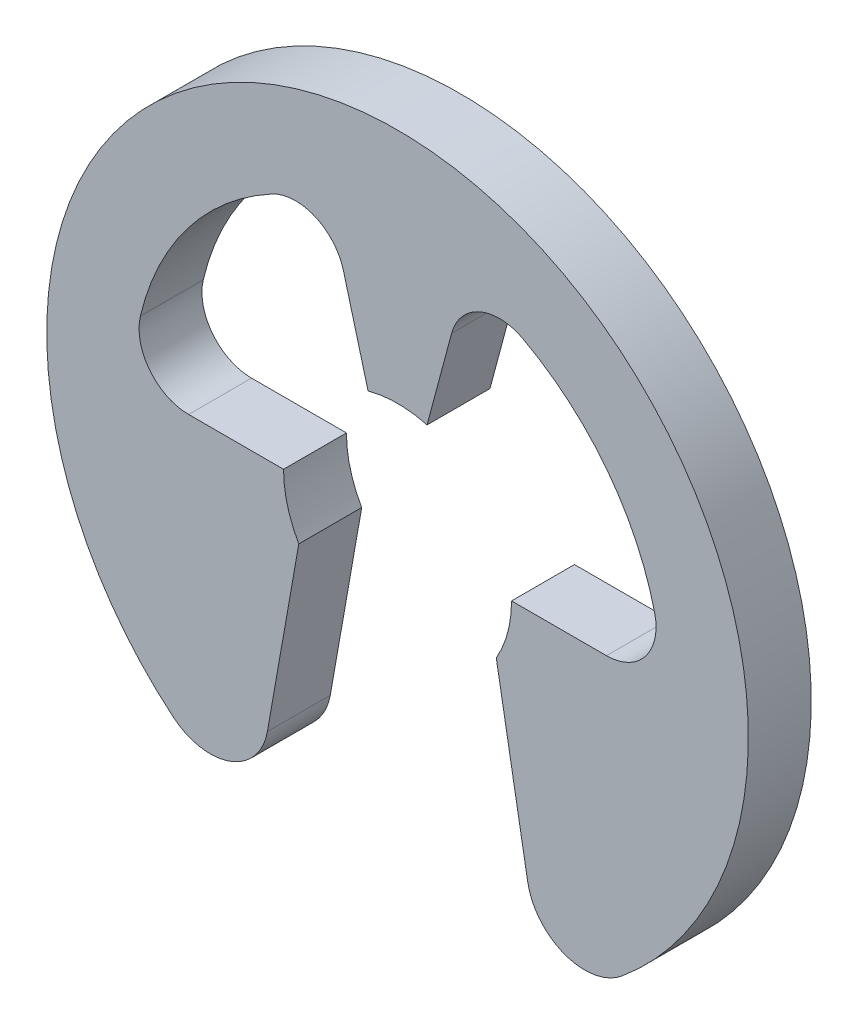
ISO-10303-21;
HEADER;
FILE_DESCRIPTION(('STEP AP214'),'2;1');
FILE_NAME('part.step','',(''),(''),'','','');
FILE_SCHEMA(('AUTOMOTIVE_DESIGN { 1 0 10303 214 1 1 1 1 }'));
ENDSEC;
DATA;
#1=APPLICATION_CONTEXT('core data for automotive mechanical design processes');
#2=APPLICATION_PROTOCOL_DEFINITION('international standard','automotive_design',2000,#1);
#3=PRODUCT_CONTEXT('',#1,'mechanical');
#4=PRODUCT('Part','Part','',(#3));
#5=PRODUCT_RELATED_PRODUCT_CATEGORY('part','',(#4));
#6=PRODUCT_DEFINITION_FORMATION('','',#4);
#7=PRODUCT_DEFINITION_CONTEXT('part definition',#1,'design');
#8=PRODUCT_DEFINITION('design','',#6,#7);
#9=PRODUCT_DEFINITION_SHAPE('','',#8);
#10=(LENGTH_UNIT() NAMED_UNIT(*) SI_UNIT(.MILLI.,.METRE.));
#11=(NAMED_UNIT(*) PLANE_ANGLE_UNIT() SI_UNIT($,.RADIAN.));
#12=(NAMED_UNIT(*) SI_UNIT($,.STERADIAN.) SOLID_ANGLE_UNIT());
#13=UNCERTAINTY_MEASURE_WITH_UNIT(LENGTH_MEASURE(1.E-05),#10,'distance_accuracy_value','');
#14=(GEOMETRIC_REPRESENTATION_CONTEXT(3) GLOBAL_UNCERTAINTY_ASSIGNED_CONTEXT((#13)) GLOBAL_UNIT_ASSIGNED_CONTEXT((#10,
#11,#12)) REPRESENTATION_CONTEXT('',''));
#15=CARTESIAN_POINT('',(0.,0.,0.));
#16=DIRECTION('',(0.,0.,1.));
#17=DIRECTION('',(1.,0.,0.));
#18=AXIS2_PLACEMENT_3D('',#15,#16,#17);
#19=CARTESIAN_POINT('',(1.32843631662842,0.315403846153846,-0.4));
#20=DIRECTION('',(0.,0.,1.));
#21=DIRECTION('',(1.,0.,0.));
#22=AXIS2_PLACEMENT_3D('',#19,#20,#21);
#23=CYLINDRICAL_SURFACE('',#22,0.315403846153846);
#24=CARTESIAN_POINT('',(1.32843631662842,0.315403846153846,0.));
#25=DIRECTION('',(0.,0.,-1.));
#26=DIRECTION('',(1.,0.,0.));
#27=AXIS2_PLACEMENT_3D('',#24,#25,#26);
#28=CIRCLE('',#27,0.315403846153846);
#29=CARTESIAN_POINT('',(1.63530942792608,0.388263160802915,0.));
#30=VERTEX_POINT('',#29);
#31=CARTESIAN_POINT('',(1.32843631662842,0.,0.));
#32=VERTEX_POINT('',#31);
#33=EDGE_CURVE('E190',#30,#32,#28,.T.);
#34=ORIENTED_EDGE('',*,*,#33,.F.);
#35=DIRECTION('',(0.,0.,1.));
#36=VECTOR('',#35,1.);
#37=CARTESIAN_POINT('',(1.63530942792608,0.388263160802915,-0.4));
#38=LINE('',#37,#36);
#39=CARTESIAN_POINT('',(1.63530942792608,0.388263160802915,-0.4));
#40=VERTEX_POINT('',#39);
#41=EDGE_CURVE('E11',#40,#30,#38,.T.);
#42=ORIENTED_EDGE('',*,*,#41,.F.);
#43=CARTESIAN_POINT('',(1.32843631662842,0.315403846153846,-0.4));
#44=DIRECTION('',(0.,0.,-1.));
#45=DIRECTION('',(1.,0.,0.));
#46=AXIS2_PLACEMENT_3D('',#43,#44,#45);
#47=CIRCLE('',#46,0.315403846153846);
#48=CARTESIAN_POINT('',(1.32843631662842,0.,-0.4));
#49=VERTEX_POINT('',#48);
#50=EDGE_CURVE('E240',#40,#49,#47,.T.);
#51=ORIENTED_EDGE('',*,*,#50,.T.);
#52=DIRECTION('',(0.,0.,1.));
#53=VECTOR('',#52,1.);
#54=CARTESIAN_POINT('',(1.32843631662842,0.,-0.4));
#55=LINE('',#54,#53);
#56=EDGE_CURVE('E36',#49,#32,#55,.T.);
#57=ORIENTED_EDGE('',*,*,#56,.T.);
#58=EDGE_LOOP('',(#34,#42,#51,#57));
#59=FACE_BOUND('',#58,.T.);
#60=ADVANCED_FACE('F33',(#59),#23,.F.);
#61=CARTESIAN_POINT('',(0.,0.,-0.4));
#62=DIRECTION('',(0.,0.,1.));
#63=DIRECTION('',(1.,0.,0.));
#64=AXIS2_PLACEMENT_3D('',#61,#62,#63);
#65=CYLINDRICAL_SURFACE('',#64,1.68076923076923);
#66=CARTESIAN_POINT('',(0.,0.,0.));
#67=DIRECTION('',(0.,0.,-1.));
#68=DIRECTION('',(1.,0.,0.));
#69=AXIS2_PLACEMENT_3D('',#66,#67,#68);
#70=CIRCLE('',#69,1.68076923076923);
#71=CARTESIAN_POINT('',(0.79828263899914,1.4790977098803,0.));
#72=VERTEX_POINT('',#71);
#73=EDGE_CURVE('E238',#72,#30,#70,.T.);
#74=ORIENTED_EDGE('',*,*,#73,.F.);
#75=DIRECTION('',(0.,0.,1.));
#76=VECTOR('',#75,1.);
#77=CARTESIAN_POINT('',(0.79828263899914,1.4790977098803,-0.4));
#78=LINE('',#77,#76);
#79=CARTESIAN_POINT('',(0.79828263899914,1.4790977098803,-0.4));
#80=VERTEX_POINT('',#79);
#81=EDGE_CURVE('E42',#80,#72,#78,.T.);
#82=ORIENTED_EDGE('',*,*,#81,.F.);
#83=CARTESIAN_POINT('',(0.,0.,-0.4));
#84=DIRECTION('',(0.,0.,-1.));
#85=DIRECTION('',(1.,0.,0.));
#86=AXIS2_PLACEMENT_3D('',#83,#84,#85);
#87=CIRCLE('',#86,1.68076923076923);
#88=EDGE_CURVE('E180',#80,#40,#87,.T.);
#89=ORIENTED_EDGE('',*,*,#88,.T.);
#90=ORIENTED_EDGE('',*,*,#41,.T.);
#91=EDGE_LOOP('',(#74,#82,#89,#90));
#92=FACE_BOUND('',#91,.T.);
#93=ADVANCED_FACE('F272',(#92),#65,.F.);
#94=CARTESIAN_POINT('',(0.648481339660182,1.20153842452851,-0.4));
#95=DIRECTION('',(0.,0.,1.));
#96=DIRECTION('',(1.,0.,0.));
#97=AXIS2_PLACEMENT_3D('',#94,#95,#96);
#98=CYLINDRICAL_SURFACE('',#97,0.315403846153846);
#99=CARTESIAN_POINT('',(0.648481339660182,1.20153842452851,0.));
#100=DIRECTION('',(0.,0.,-1.));
#101=DIRECTION('',(1.,0.,0.));
#102=AXIS2_PLACEMENT_3D('',#99,#100,#101);
#103=CIRCLE('',#102,0.315403846153846);
#104=CARTESIAN_POINT('',(0.343824618949278,1.28317094681171,0.));
#105=VERTEX_POINT('',#104);
#106=EDGE_CURVE('E167',#105,#72,#103,.T.);
#107=ORIENTED_EDGE('',*,*,#106,.F.);
#108=DIRECTION('',(0.,0.,1.));
#109=VECTOR('',#108,1.);
#110=CARTESIAN_POINT('',(0.343824618949278,1.28317094681171,-0.4));
#111=LINE('',#110,#109);
#112=CARTESIAN_POINT('',(0.343824618949278,1.28317094681171,-0.4));
#113=VERTEX_POINT('',#112);
#114=EDGE_CURVE('E162',#113,#105,#111,.T.);
#115=ORIENTED_EDGE('',*,*,#114,.F.);
#116=CARTESIAN_POINT('',(0.648481339660182,1.20153842452851,-0.4));
#117=DIRECTION('',(0.,0.,-1.));
#118=DIRECTION('',(1.,0.,0.));
#119=AXIS2_PLACEMENT_3D('',#116,#117,#118);
#120=CIRCLE('',#119,0.315403846153846);
#121=EDGE_CURVE('E165',#113,#80,#120,.T.);
#122=ORIENTED_EDGE('',*,*,#121,.T.);
#123=ORIENTED_EDGE('',*,*,#81,.T.);
#124=EDGE_LOOP('',(#107,#115,#122,#123));
#125=FACE_BOUND('',#124,.T.);
#126=ADVANCED_FACE('F164',(#125),#98,.F.);
#127=CARTESIAN_POINT('',(0.187643807699328,0.700296224059574,-0.4));
#128=DIRECTION('',(0.965925826289068,-0.258819045102522,0.));
#129=DIRECTION('',(0.258819045102522,0.965925826289068,0.));
#130=AXIS2_PLACEMENT_3D('',#127,#128,#129);
#131=PLANE('',#130);
#132=DIRECTION('',(0.258819045102522,0.965925826289068,0.));
#133=VECTOR('',#132,1.);
#134=CARTESIAN_POINT('',(0.187643807699328,0.700296224059574,0.));
#135=LINE('',#134,#133);
#136=CARTESIAN_POINT('',(0.187643807699328,0.700296224059574,0.));
#137=VERTEX_POINT('',#136);
#138=EDGE_CURVE('E235',#137,#105,#135,.T.);
#139=ORIENTED_EDGE('',*,*,#138,.F.);
#140=DIRECTION('',(0.,0.,1.));
#141=VECTOR('',#140,1.);
#142=CARTESIAN_POINT('',(0.187643807699328,0.700296224059574,-0.4));
#143=LINE('',#142,#141);
#144=CARTESIAN_POINT('',(0.187643807699328,0.700296224059574,-0.4));
#145=VERTEX_POINT('',#144);
#146=EDGE_CURVE('E172',#145,#137,#143,.T.);
#147=ORIENTED_EDGE('',*,*,#146,.F.);
#148=DIRECTION('',(0.258819045102522,0.965925826289068,0.));
#149=VECTOR('',#148,1.);
#150=CARTESIAN_POINT('',(0.187643807699328,0.700296224059574,-0.4));
#151=LINE('',#150,#149);
#152=EDGE_CURVE('E178',#145,#113,#151,.T.);
#153=ORIENTED_EDGE('',*,*,#152,.T.);
#154=ORIENTED_EDGE('',*,*,#114,.T.);
#155=EDGE_LOOP('',(#139,#147,#153,#154));
#156=FACE_BOUND('',#155,.T.);
#157=ADVANCED_FACE('F182',(#156),#131,.T.);
#158=CARTESIAN_POINT('',(0.,0.,-0.4));
#159=DIRECTION('',(0.,0.,1.));
#160=DIRECTION('',(1.,0.,0.));
#161=AXIS2_PLACEMENT_3D('',#158,#159,#160);
#162=CYLINDRICAL_SURFACE('',#161,0.725);
#163=CARTESIAN_POINT('',(0.,0.,0.));
#164=DIRECTION('',(0.,0.,-1.));
#165=DIRECTION('',(-1.,0.,0.));
#166=AXIS2_PLACEMENT_3D('',#163,#164,#165);
#167=CIRCLE('',#166,0.725);
#168=CARTESIAN_POINT('',(-0.187643807699328,0.700296224059574,0.));
#169=VERTEX_POINT('',#168);
#170=EDGE_CURVE('E232',#169,#137,#167,.T.);
#171=ORIENTED_EDGE('',*,*,#170,.F.);
#172=DIRECTION('',(0.,0.,1.));
#173=VECTOR('',#172,1.);
#174=CARTESIAN_POINT('',(-0.187643807699328,0.700296224059574,-0.4));
#175=LINE('',#174,#173);
#176=CARTESIAN_POINT('',(-0.187643807699328,0.700296224059574,-0.4));
#177=VERTEX_POINT('',#176);
#178=EDGE_CURVE('E244',#177,#169,#175,.T.);
#179=ORIENTED_EDGE('',*,*,#178,.F.);
#180=CARTESIAN_POINT('',(0.,0.,-0.4));
#181=DIRECTION('',(0.,0.,-1.));
#182=DIRECTION('',(-1.,0.,0.));
#183=AXIS2_PLACEMENT_3D('',#180,#181,#182);
#184=CIRCLE('',#183,0.725);
#185=EDGE_CURVE('E183',#177,#145,#184,.T.);
#186=ORIENTED_EDGE('',*,*,#185,.T.);
#187=ORIENTED_EDGE('',*,*,#146,.T.);
#188=EDGE_LOOP('',(#171,#179,#186,#187));
#189=FACE_BOUND('',#188,.T.);
#190=ADVANCED_FACE('F285',(#189),#162,.F.);
#191=CARTESIAN_POINT('',(-0.187643807699328,0.700296224059574,-0.4));
#192=DIRECTION('',(-0.965925826289068,-0.258819045102522,0.));
#193=DIRECTION('',(0.258819045102522,-0.965925826289068,0.));
#194=AXIS2_PLACEMENT_3D('',#191,#192,#193);
#195=PLANE('',#194);
#196=DIRECTION('',(0.258819045102522,-0.965925826289068,0.));
#197=VECTOR('',#196,1.);
#198=CARTESIAN_POINT('',(-0.187643807699328,0.700296224059574,0.));
#199=LINE('',#198,#197);
#200=CARTESIAN_POINT('',(-0.343824618949278,1.28317094681171,0.));
#201=VERTEX_POINT('',#200);
#202=EDGE_CURVE('E229',#201,#169,#199,.T.);
#203=ORIENTED_EDGE('',*,*,#202,.F.);
#204=DIRECTION('',(0.,0.,1.));
#205=VECTOR('',#204,1.);
#206=CARTESIAN_POINT('',(-0.343824618949278,1.28317094681171,-0.4));
#207=LINE('',#206,#205);
#208=CARTESIAN_POINT('',(-0.343824618949278,1.28317094681171,-0.4));
#209=VERTEX_POINT('',#208);
#210=EDGE_CURVE('E246',#209,#201,#207,.T.);
#211=ORIENTED_EDGE('',*,*,#210,.F.);
#212=DIRECTION('',(0.258819045102522,-0.965925826289068,0.));
#213=VECTOR('',#212,1.);
#214=CARTESIAN_POINT('',(-0.187643807699328,0.700296224059574,-0.4));
#215=LINE('',#214,#213);
#216=EDGE_CURVE('E185',#209,#177,#215,.T.);
#217=ORIENTED_EDGE('',*,*,#216,.T.);
#218=ORIENTED_EDGE('',*,*,#178,.T.);
#219=EDGE_LOOP('',(#203,#211,#217,#218));
#220=FACE_BOUND('',#219,.T.);
#221=ADVANCED_FACE('F288',(#220),#195,.T.);
#222=CARTESIAN_POINT('',(-0.648481339660182,1.20153842452851,-0.4));
#223=DIRECTION('',(0.,0.,1.));
#224=DIRECTION('',(1.,0.,0.));
#225=AXIS2_PLACEMENT_3D('',#222,#223,#224);
#226=CYLINDRICAL_SURFACE('',#225,0.315403846153846);
#227=CARTESIAN_POINT('',(-0.648481339660182,1.20153842452851,0.));
#228=DIRECTION('',(0.,0.,-1.));
#229=DIRECTION('',(1.,0.,0.));
#230=AXIS2_PLACEMENT_3D('',#227,#228,#229);
#231=CIRCLE('',#230,0.315403846153846);
#232=CARTESIAN_POINT('',(-0.79828263899914,1.4790977098803,0.));
#233=VERTEX_POINT('',#232);
#234=EDGE_CURVE('E226',#233,#201,#231,.T.);
#235=ORIENTED_EDGE('',*,*,#234,.F.);
#236=DIRECTION('',(0.,0.,1.));
#237=VECTOR('',#236,1.);
#238=CARTESIAN_POINT('',(-0.79828263899914,1.4790977098803,-0.4));
#239=LINE('',#238,#237);
#240=CARTESIAN_POINT('',(-0.79828263899914,1.4790977098803,-0.4));
#241=VERTEX_POINT('',#240);
#242=EDGE_CURVE('E248',#241,#233,#239,.T.);
#243=ORIENTED_EDGE('',*,*,#242,.F.);
#244=CARTESIAN_POINT('',(-0.648481339660182,1.20153842452851,-0.4));
#245=DIRECTION('',(0.,0.,-1.));
#246=DIRECTION('',(1.,0.,0.));
#247=AXIS2_PLACEMENT_3D('',#244,#245,#246);
#248=CIRCLE('',#247,0.315403846153846);
#249=EDGE_CURVE('E496',#241,#209,#248,.T.);
#250=ORIENTED_EDGE('',*,*,#249,.T.);
#251=ORIENTED_EDGE('',*,*,#210,.T.);
#252=EDGE_LOOP('',(#235,#243,#250,#251));
#253=FACE_BOUND('',#252,.T.);
#254=ADVANCED_FACE('F292',(#253),#226,.F.);
#255=CARTESIAN_POINT('',(0.,0.,-0.4));
#256=DIRECTION('',(0.,0.,1.));
#257=DIRECTION('',(1.,0.,0.));
#258=AXIS2_PLACEMENT_3D('',#255,#256,#257);
#259=CYLINDRICAL_SURFACE('',#258,1.68076923076923);
#260=CARTESIAN_POINT('',(0.,0.,0.));
#261=DIRECTION('',(0.,0.,-1.));
#262=DIRECTION('',(1.,0.,0.));
#263=AXIS2_PLACEMENT_3D('',#260,#261,#262);
#264=CIRCLE('',#263,1.68076923076923);
#265=CARTESIAN_POINT('',(-1.63530942792608,0.388263160802915,0.));
#266=VERTEX_POINT('',#265);
#267=EDGE_CURVE('E223',#266,#233,#264,.T.);
#268=ORIENTED_EDGE('',*,*,#267,.F.);
#269=DIRECTION('',(0.,0.,1.));
#270=VECTOR('',#269,1.);
#271=CARTESIAN_POINT('',(-1.63530942792608,0.388263160802915,-0.4));
#272=LINE('',#271,#270);
#273=CARTESIAN_POINT('',(-1.63530942792608,0.388263160802915,-0.4));
#274=VERTEX_POINT('',#273);
#275=EDGE_CURVE('E250',#274,#266,#272,.T.);
#276=ORIENTED_EDGE('',*,*,#275,.F.);
#277=CARTESIAN_POINT('',(0.,0.,-0.4));
#278=DIRECTION('',(0.,0.,-1.));
#279=DIRECTION('',(1.,0.,0.));
#280=AXIS2_PLACEMENT_3D('',#277,#278,#279);
#281=CIRCLE('',#280,1.68076923076923);
#282=EDGE_CURVE('E500',#274,#241,#281,.T.);
#283=ORIENTED_EDGE('',*,*,#282,.T.);
#284=ORIENTED_EDGE('',*,*,#242,.T.);
#285=EDGE_LOOP('',(#268,#276,#283,#284));
#286=FACE_BOUND('',#285,.T.);
#287=ADVANCED_FACE('F296',(#286),#259,.F.);
#288=CARTESIAN_POINT('',(-1.32843631662842,0.315403846153846,-0.4));
#289=DIRECTION('',(0.,0.,1.));
#290=DIRECTION('',(1.,0.,0.));
#291=AXIS2_PLACEMENT_3D('',#288,#289,#290);
#292=CYLINDRICAL_SURFACE('',#291,0.315403846153846);
#293=CARTESIAN_POINT('',(-1.32843631662842,0.315403846153846,0.));
#294=DIRECTION('',(0.,0.,-1.));
#295=DIRECTION('',(1.,0.,0.));
#296=AXIS2_PLACEMENT_3D('',#293,#294,#295);
#297=CIRCLE('',#296,0.315403846153846);
#298=CARTESIAN_POINT('',(-1.32843631662842,0.,0.));
#299=VERTEX_POINT('',#298);
#300=EDGE_CURVE('E220',#299,#266,#297,.T.);
#301=ORIENTED_EDGE('',*,*,#300,.F.);
#302=DIRECTION('',(0.,0.,1.));
#303=VECTOR('',#302,1.);
#304=CARTESIAN_POINT('',(-1.32843631662842,0.,-0.4));
#305=LINE('',#304,#303);
#306=CARTESIAN_POINT('',(-1.32843631662842,0.,-0.4));
#307=VERTEX_POINT('',#306);
#308=EDGE_CURVE('E252',#307,#299,#305,.T.);
#309=ORIENTED_EDGE('',*,*,#308,.F.);
#310=CARTESIAN_POINT('',(-1.32843631662842,0.315403846153846,-0.4));
#311=DIRECTION('',(0.,0.,-1.));
#312=DIRECTION('',(1.,0.,0.));
#313=AXIS2_PLACEMENT_3D('',#310,#311,#312);
#314=CIRCLE('',#313,0.315403846153846);
#315=EDGE_CURVE('E489',#307,#274,#314,.T.);
#316=ORIENTED_EDGE('',*,*,#315,.T.);
#317=ORIENTED_EDGE('',*,*,#275,.T.);
#318=EDGE_LOOP('',(#301,#309,#316,#317));
#319=FACE_BOUND('',#318,.T.);
#320=ADVANCED_FACE('F300',(#319),#292,.F.);
#321=CARTESIAN_POINT('',(-0.725,0.,-0.4));
#322=DIRECTION('',(0.,1.,0.));
#323=DIRECTION('',(-1.,0.,0.));
#324=AXIS2_PLACEMENT_3D('',#321,#322,#323);
#325=PLANE('',#324);
#326=DIRECTION('',(-1.,0.,0.));
#327=VECTOR('',#326,1.);
#328=CARTESIAN_POINT('',(-0.725,0.,0.));
#329=LINE('',#328,#327);
#330=CARTESIAN_POINT('',(-0.725,0.,0.));
#331=VERTEX_POINT('',#330);
#332=EDGE_CURVE('E217',#331,#299,#329,.T.);
#333=ORIENTED_EDGE('',*,*,#332,.F.);
#334=DIRECTION('',(0.,0.,1.));
#335=VECTOR('',#334,1.);
#336=CARTESIAN_POINT('',(-0.725,0.,-0.4));
#337=LINE('',#336,#335);
#338=CARTESIAN_POINT('',(-0.725,0.,-0.4));
#339=VERTEX_POINT('',#338);
#340=EDGE_CURVE('E254',#339,#331,#337,.T.);
#341=ORIENTED_EDGE('',*,*,#340,.F.);
#342=DIRECTION('',(-1.,0.,0.));
#343=VECTOR('',#342,1.);
#344=CARTESIAN_POINT('',(-0.725,0.,-0.4));
#345=LINE('',#344,#343);
#346=EDGE_CURVE('E485',#339,#307,#345,.T.);
#347=ORIENTED_EDGE('',*,*,#346,.T.);
#348=ORIENTED_EDGE('',*,*,#308,.T.);
#349=EDGE_LOOP('',(#333,#341,#347,#348));
#350=FACE_BOUND('',#349,.T.);
#351=ADVANCED_FACE('F304',(#350),#325,.T.);
#352=CARTESIAN_POINT('',(0.,0.,-0.4));
#353=DIRECTION('',(0.,0.,1.));
#354=DIRECTION('',(1.,0.,0.));
#355=AXIS2_PLACEMENT_3D('',#352,#353,#354);
#356=CYLINDRICAL_SURFACE('',#355,0.725);
#357=CARTESIAN_POINT('',(0.,0.,0.));
#358=DIRECTION('',(0.,0.,-1.));
#359=DIRECTION('',(1.,0.,0.));
#360=AXIS2_PLACEMENT_3D('',#357,#358,#359);
#361=CIRCLE('',#360,0.725);
#362=CARTESIAN_POINT('',(-0.627868417743718,-0.362500000000001,0.));
#363=VERTEX_POINT('',#362);
#364=EDGE_CURVE('E214',#363,#331,#361,.T.);
#365=ORIENTED_EDGE('',*,*,#364,.F.);
#366=DIRECTION('',(0.,0.,1.));
#367=VECTOR('',#366,1.);
#368=CARTESIAN_POINT('',(-0.627868417743718,-0.362500000000001,-0.4));
#369=LINE('',#368,#367);
#370=CARTESIAN_POINT('',(-0.627868417743718,-0.362500000000001,-0.4));
#371=VERTEX_POINT('',#370);
#372=EDGE_CURVE('E256',#371,#363,#369,.T.);
#373=ORIENTED_EDGE('',*,*,#372,.F.);
#374=CARTESIAN_POINT('',(0.,0.,-0.4));
#375=DIRECTION('',(0.,0.,-1.));
#376=DIRECTION('',(1.,0.,0.));
#377=AXIS2_PLACEMENT_3D('',#374,#375,#376);
#378=CIRCLE('',#377,0.725);
#379=EDGE_CURVE('E506',#371,#339,#378,.T.);
#380=ORIENTED_EDGE('',*,*,#379,.T.);
#381=ORIENTED_EDGE('',*,*,#340,.T.);
#382=EDGE_LOOP('',(#365,#373,#380,#381));
#383=FACE_BOUND('',#382,.T.);
#384=ADVANCED_FACE('F308',(#383),#356,.F.);
#385=CARTESIAN_POINT('',(-0.627868417743717,-0.362500000000001,-0.4));
#386=DIRECTION('',(0.984807753012208,-0.17364817766693,0.));
#387=DIRECTION('',(0.17364817766693,0.984807753012208,0.));
#388=AXIS2_PLACEMENT_3D('',#385,#386,#387);
#389=PLANE('',#388);
#390=DIRECTION('',(0.17364817766693,0.984807753012208,0.));
#391=VECTOR('',#390,1.);
#392=CARTESIAN_POINT('',(-0.627868417743717,-0.362500000000001,0.));
#393=LINE('',#392,#391);
#394=CARTESIAN_POINT('',(-0.827723045530438,-1.49593191713329,0.));
#395=VERTEX_POINT('',#394);
#396=EDGE_CURVE('E211',#395,#363,#393,.T.);
#397=ORIENTED_EDGE('',*,*,#396,.F.);
#398=DIRECTION('',(0.,0.,1.));
#399=VECTOR('',#398,1.);
#400=CARTESIAN_POINT('',(-0.827723045530438,-1.49593191713329,-0.4));
#401=LINE('',#400,#399);
#402=CARTESIAN_POINT('',(-0.827723045530438,-1.49593191713329,-0.4));
#403=VERTEX_POINT('',#402);
#404=EDGE_CURVE('E258',#403,#395,#401,.T.);
#405=ORIENTED_EDGE('',*,*,#404,.F.);
#406=DIRECTION('',(0.17364817766693,0.984807753012208,0.));
#407=VECTOR('',#406,1.);
#408=CARTESIAN_POINT('',(-0.627868417743717,-0.362500000000001,-0.4));
#409=LINE('',#408,#407);
#410=EDGE_CURVE('E478',#403,#371,#409,.T.);
#411=ORIENTED_EDGE('',*,*,#410,.T.);
#412=ORIENTED_EDGE('',*,*,#372,.T.);
#413=EDGE_LOOP('',(#397,#405,#411,#412));
#414=FACE_BOUND('',#413,.T.);
#415=ADVANCED_FACE('F312',(#414),#389,.T.);
#416=CARTESIAN_POINT('',(-1.19062470251544,-1.43194256366303,-0.4));
#417=DIRECTION('',(0.,0.,1.));
#418=DIRECTION('',(1.,0.,0.));
#419=AXIS2_PLACEMENT_3D('',#416,#417,#418);
#420=CYLINDRICAL_SURFACE('',#419,0.3685);
#421=CARTESIAN_POINT('',(-1.19062470251544,-1.43194256366303,0.));
#422=DIRECTION('',(0.,0.,1.));
#423=DIRECTION('',(1.,0.,0.));
#424=AXIS2_PLACEMENT_3D('',#421,#422,#423);
#425=CIRCLE('',#424,0.3685);
#426=CARTESIAN_POINT('',(-1.42622178784972,-1.71529087119634,0.));
#427=VERTEX_POINT('',#426);
#428=EDGE_CURVE('E208',#427,#395,#425,.T.);
#429=ORIENTED_EDGE('',*,*,#428,.F.);
#430=DIRECTION('',(0.,0.,1.));
#431=VECTOR('',#430,1.);
#432=CARTESIAN_POINT('',(-1.42622178784972,-1.71529087119634,-0.4));
#433=LINE('',#432,#431);
#434=CARTESIAN_POINT('',(-1.42622178784972,-1.71529087119634,-0.4));
#435=VERTEX_POINT('',#434);
#436=EDGE_CURVE('E260',#435,#427,#433,.T.);
#437=ORIENTED_EDGE('',*,*,#436,.F.);
#438=CARTESIAN_POINT('',(-1.19062470251544,-1.43194256366303,-0.4));
#439=DIRECTION('',(0.,0.,1.));
#440=DIRECTION('',(1.,0.,0.));
#441=AXIS2_PLACEMENT_3D('',#438,#439,#440);
#442=CIRCLE('',#441,0.3685);
#443=EDGE_CURVE('E474',#435,#403,#442,.T.);
#444=ORIENTED_EDGE('',*,*,#443,.T.);
#445=ORIENTED_EDGE('',*,*,#404,.T.);
#446=EDGE_LOOP('',(#429,#437,#444,#445));
#447=FACE_BOUND('',#446,.T.);
#448=ADVANCED_FACE('F316',(#447),#420,.T.);
#449=CARTESIAN_POINT('',(0.,0.,-0.4));
#450=DIRECTION('',(0.,0.,1.));
#451=DIRECTION('',(1.,0.,0.));
#452=AXIS2_PLACEMENT_3D('',#449,#450,#451);
#453=CYLINDRICAL_SURFACE('',#452,2.23076923076923);
#454=CARTESIAN_POINT('',(0.,0.,0.));
#455=DIRECTION('',(0.,0.,1.));
#456=DIRECTION('',(1.,0.,0.));
#457=AXIS2_PLACEMENT_3D('',#454,#455,#456);
#458=CIRCLE('',#457,2.23076923076923);
#459=CARTESIAN_POINT('',(1.42622178784971,-1.71529087119634,0.));
#460=VERTEX_POINT('',#459);
#461=EDGE_CURVE('E205',#460,#427,#458,.T.);
#462=ORIENTED_EDGE('',*,*,#461,.F.);
#463=DIRECTION('',(0.,0.,1.));
#464=VECTOR('',#463,1.);
#465=CARTESIAN_POINT('',(1.42622178784971,-1.71529087119634,-0.4));
#466=LINE('',#465,#464);
#467=CARTESIAN_POINT('',(1.42622178784971,-1.71529087119634,-0.4));
#468=VERTEX_POINT('',#467);
#469=EDGE_CURVE('E262',#468,#460,#466,.T.);
#470=ORIENTED_EDGE('',*,*,#469,.F.);
#471=CARTESIAN_POINT('',(0.,0.,-0.4));
#472=DIRECTION('',(0.,0.,1.));
#473=DIRECTION('',(1.,0.,0.));
#474=AXIS2_PLACEMENT_3D('',#471,#472,#473);
#475=CIRCLE('',#474,2.23076923076923);
#476=EDGE_CURVE('E510',#468,#435,#475,.T.);
#477=ORIENTED_EDGE('',*,*,#476,.T.);
#478=ORIENTED_EDGE('',*,*,#436,.T.);
#479=EDGE_LOOP('',(#462,#470,#477,#478));
#480=FACE_BOUND('',#479,.T.);
#481=ADVANCED_FACE('F320',(#480),#453,.T.);
#482=CARTESIAN_POINT('',(1.19062470251544,-1.43194256366303,-0.4));
#483=DIRECTION('',(0.,0.,1.));
#484=DIRECTION('',(1.,0.,0.));
#485=AXIS2_PLACEMENT_3D('',#482,#483,#484);
#486=CYLINDRICAL_SURFACE('',#485,0.3685);
#487=CARTESIAN_POINT('',(1.19062470251544,-1.43194256366303,0.));
#488=DIRECTION('',(0.,0.,1.));
#489=DIRECTION('',(1.,0.,0.));
#490=AXIS2_PLACEMENT_3D('',#487,#488,#489);
#491=CIRCLE('',#490,0.3685);
#492=CARTESIAN_POINT('',(0.827723045530438,-1.49593191713329,0.));
#493=VERTEX_POINT('',#492);
#494=EDGE_CURVE('E202',#493,#460,#491,.T.);
#495=ORIENTED_EDGE('',*,*,#494,.F.);
#496=DIRECTION('',(0.,0.,1.));
#497=VECTOR('',#496,1.);
#498=CARTESIAN_POINT('',(0.827723045530438,-1.49593191713329,-0.4));
#499=LINE('',#498,#497);
#500=CARTESIAN_POINT('',(0.827723045530438,-1.49593191713329,-0.4));
#501=VERTEX_POINT('',#500);
#502=EDGE_CURVE('E264',#501,#493,#499,.T.);
#503=ORIENTED_EDGE('',*,*,#502,.F.);
#504=CARTESIAN_POINT('',(1.19062470251544,-1.43194256366303,-0.4));
#505=DIRECTION('',(0.,0.,1.));
#506=DIRECTION('',(1.,0.,0.));
#507=AXIS2_PLACEMENT_3D('',#504,#505,#506);
#508=CIRCLE('',#507,0.3685);
#509=EDGE_CURVE('E467',#501,#468,#508,.T.);
#510=ORIENTED_EDGE('',*,*,#509,.T.);
#511=ORIENTED_EDGE('',*,*,#469,.T.);
#512=EDGE_LOOP('',(#495,#503,#510,#511));
#513=FACE_BOUND('',#512,.T.);
#514=ADVANCED_FACE('F324',(#513),#486,.T.);
#515=CARTESIAN_POINT('',(0.627868417743717,-0.362500000000001,-0.4));
#516=DIRECTION('',(-0.984807753012208,-0.17364817766693,0.));
#517=DIRECTION('',(0.17364817766693,-0.984807753012208,0.));
#518=AXIS2_PLACEMENT_3D('',#515,#516,#517);
#519=PLANE('',#518);
#520=DIRECTION('',(0.17364817766693,-0.984807753012208,0.));
#521=VECTOR('',#520,1.);
#522=CARTESIAN_POINT('',(0.627868417743717,-0.362500000000001,0.));
#523=LINE('',#522,#521);
#524=CARTESIAN_POINT('',(0.627868417743717,-0.362500000000001,0.));
#525=VERTEX_POINT('',#524);
#526=EDGE_CURVE('E199',#525,#493,#523,.T.);
#527=ORIENTED_EDGE('',*,*,#526,.F.);
#528=DIRECTION('',(0.,0.,1.));
#529=VECTOR('',#528,1.);
#530=CARTESIAN_POINT('',(0.627868417743717,-0.362500000000001,-0.4));
#531=LINE('',#530,#529);
#532=CARTESIAN_POINT('',(0.627868417743717,-0.362500000000001,-0.4));
#533=VERTEX_POINT('',#532);
#534=EDGE_CURVE('E266',#533,#525,#531,.T.);
#535=ORIENTED_EDGE('',*,*,#534,.F.);
#536=DIRECTION('',(0.17364817766693,-0.984807753012208,0.));
#537=VECTOR('',#536,1.);
#538=CARTESIAN_POINT('',(0.627868417743717,-0.362500000000001,-0.4));
#539=LINE('',#538,#537);
#540=EDGE_CURVE('E463',#533,#501,#539,.T.);
#541=ORIENTED_EDGE('',*,*,#540,.T.);
#542=ORIENTED_EDGE('',*,*,#502,.T.);
#543=EDGE_LOOP('',(#527,#535,#541,#542));
#544=FACE_BOUND('',#543,.T.);
#545=ADVANCED_FACE('F328',(#544),#519,.T.);
#546=CARTESIAN_POINT('',(0.,0.,-0.4));
#547=DIRECTION('',(0.,0.,1.));
#548=DIRECTION('',(1.,0.,0.));
#549=AXIS2_PLACEMENT_3D('',#546,#547,#548);
#550=CYLINDRICAL_SURFACE('',#549,0.725);
#551=CARTESIAN_POINT('',(0.,0.,0.));
#552=DIRECTION('',(0.,0.,-1.));
#553=DIRECTION('',(1.,0.,0.));
#554=AXIS2_PLACEMENT_3D('',#551,#552,#553);
#555=CIRCLE('',#554,0.725);
#556=CARTESIAN_POINT('',(0.725,0.,0.));
#557=VERTEX_POINT('',#556);
#558=EDGE_CURVE('E196',#557,#525,#555,.T.);
#559=ORIENTED_EDGE('',*,*,#558,.F.);
#560=DIRECTION('',(0.,0.,1.));
#561=VECTOR('',#560,1.);
#562=CARTESIAN_POINT('',(0.725,0.,-0.4));
#563=LINE('',#562,#561);
#564=CARTESIAN_POINT('',(0.725,0.,-0.4));
#565=VERTEX_POINT('',#564);
#566=EDGE_CURVE('E267',#565,#557,#563,.T.);
#567=ORIENTED_EDGE('',*,*,#566,.F.);
#568=CARTESIAN_POINT('',(0.,0.,-0.4));
#569=DIRECTION('',(0.,0.,-1.));
#570=DIRECTION('',(1.,0.,0.));
#571=AXIS2_PLACEMENT_3D('',#568,#569,#570);
#572=CIRCLE('',#571,0.725);
#573=EDGE_CURVE('E514',#565,#533,#572,.T.);
#574=ORIENTED_EDGE('',*,*,#573,.T.);
#575=ORIENTED_EDGE('',*,*,#534,.T.);
#576=EDGE_LOOP('',(#559,#567,#574,#575));
#577=FACE_BOUND('',#576,.T.);
#578=ADVANCED_FACE('F332',(#577),#550,.F.);
#579=CARTESIAN_POINT('',(0.725,0.,-0.4));
#580=DIRECTION('',(0.,1.,0.));
#581=DIRECTION('',(0.,0.,1.));
#582=AXIS2_PLACEMENT_3D('',#579,#580,#581);
#583=PLANE('',#582);
#584=DIRECTION('',(-1.,0.,0.));
#585=VECTOR('',#584,1.);
#586=CARTESIAN_POINT('',(0.725,0.,0.));
#587=LINE('',#586,#585);
#588=EDGE_CURVE('E193',#32,#557,#587,.T.);
#589=ORIENTED_EDGE('',*,*,#588,.F.);
#590=ORIENTED_EDGE('',*,*,#56,.F.);
#591=DIRECTION('',(-1.,0.,0.));
#592=VECTOR('',#591,1.);
#593=CARTESIAN_POINT('',(0.725,0.,-0.4));
#594=LINE('',#593,#592);
#595=EDGE_CURVE('E516',#49,#565,#594,.T.);
#596=ORIENTED_EDGE('',*,*,#595,.T.);
#597=ORIENTED_EDGE('',*,*,#566,.T.);
#598=EDGE_LOOP('',(#589,#590,#596,#597));
#599=FACE_BOUND('',#598,.T.);
#600=ADVANCED_FACE('F269',(#599),#583,.T.);
#601=CARTESIAN_POINT('',(1.32843631662842,0.315403846153846,-0.4));
#602=DIRECTION('',(0.,0.,1.));
#603=DIRECTION('',(1.,0.,0.));
#604=AXIS2_PLACEMENT_3D('',#601,#602,#603);
#605=PLANE('',#604);
#606=ORIENTED_EDGE('',*,*,#50,.F.);
#607=ORIENTED_EDGE('',*,*,#88,.F.);
#608=ORIENTED_EDGE('',*,*,#121,.F.);
#609=ORIENTED_EDGE('',*,*,#152,.F.);
#610=ORIENTED_EDGE('',*,*,#185,.F.);
#611=ORIENTED_EDGE('',*,*,#216,.F.);
#612=ORIENTED_EDGE('',*,*,#249,.F.);
#613=ORIENTED_EDGE('',*,*,#282,.F.);
#614=ORIENTED_EDGE('',*,*,#315,.F.);
#615=ORIENTED_EDGE('',*,*,#346,.F.);
#616=ORIENTED_EDGE('',*,*,#379,.F.);
#617=ORIENTED_EDGE('',*,*,#410,.F.);
#618=ORIENTED_EDGE('',*,*,#443,.F.);
#619=ORIENTED_EDGE('',*,*,#476,.F.);
#620=ORIENTED_EDGE('',*,*,#509,.F.);
#621=ORIENTED_EDGE('',*,*,#540,.F.);
#622=ORIENTED_EDGE('',*,*,#573,.F.);
#623=ORIENTED_EDGE('',*,*,#595,.F.);
#624=EDGE_LOOP('',(#606,#607,#608,#609,#610,#611,#612,#613,#614,#615,#616,#617,#618,#619,#620,
#621,#622,#623));
#625=FACE_BOUND('',#624,.T.);
#626=ADVANCED_FACE('F176',(#625),#605,.F.);
#627=CARTESIAN_POINT('',(1.32843631662842,0.315403846153846,0.));
#628=DIRECTION('',(0.,0.,1.));
#629=DIRECTION('',(1.,0.,0.));
#630=AXIS2_PLACEMENT_3D('',#627,#628,#629);
#631=PLANE('',#630);
#632=ORIENTED_EDGE('',*,*,#33,.T.);
#633=ORIENTED_EDGE('',*,*,#588,.T.);
#634=ORIENTED_EDGE('',*,*,#558,.T.);
#635=ORIENTED_EDGE('',*,*,#526,.T.);
#636=ORIENTED_EDGE('',*,*,#494,.T.);
#637=ORIENTED_EDGE('',*,*,#461,.T.);
#638=ORIENTED_EDGE('',*,*,#428,.T.);
#639=ORIENTED_EDGE('',*,*,#396,.T.);
#640=ORIENTED_EDGE('',*,*,#364,.T.);
#641=ORIENTED_EDGE('',*,*,#332,.T.);
#642=ORIENTED_EDGE('',*,*,#300,.T.);
#643=ORIENTED_EDGE('',*,*,#267,.T.);
#644=ORIENTED_EDGE('',*,*,#234,.T.);
#645=ORIENTED_EDGE('',*,*,#202,.T.);
#646=ORIENTED_EDGE('',*,*,#170,.T.);
#647=ORIENTED_EDGE('',*,*,#138,.T.);
#648=ORIENTED_EDGE('',*,*,#106,.T.);
#649=ORIENTED_EDGE('',*,*,#73,.T.);
#650=EDGE_LOOP('',(#632,#633,#634,#635,#636,#637,#638,#639,#640,#641,#642,#643,#644,#645,#646,
#647,#648,#649));
#651=FACE_BOUND('',#650,.T.);
#652=ADVANCED_FACE('F271',(#651),#631,.T.);
#653=CLOSED_SHELL('',(#60,#93,#126,#157,#190,#221,#254,#287,#320,#351,#384,#415,#448,#481,#514,
#545,#578,#600,#626,#652));
#654=MANIFOLD_SOLID_BREP('B2',#653);
#655=ADVANCED_BREP_SHAPE_REPRESENTATION('',(#18,#654),#14);
#656=SHAPE_DEFINITION_REPRESENTATION(#9,#655);
ENDSEC;
END-ISO-10303-21;
